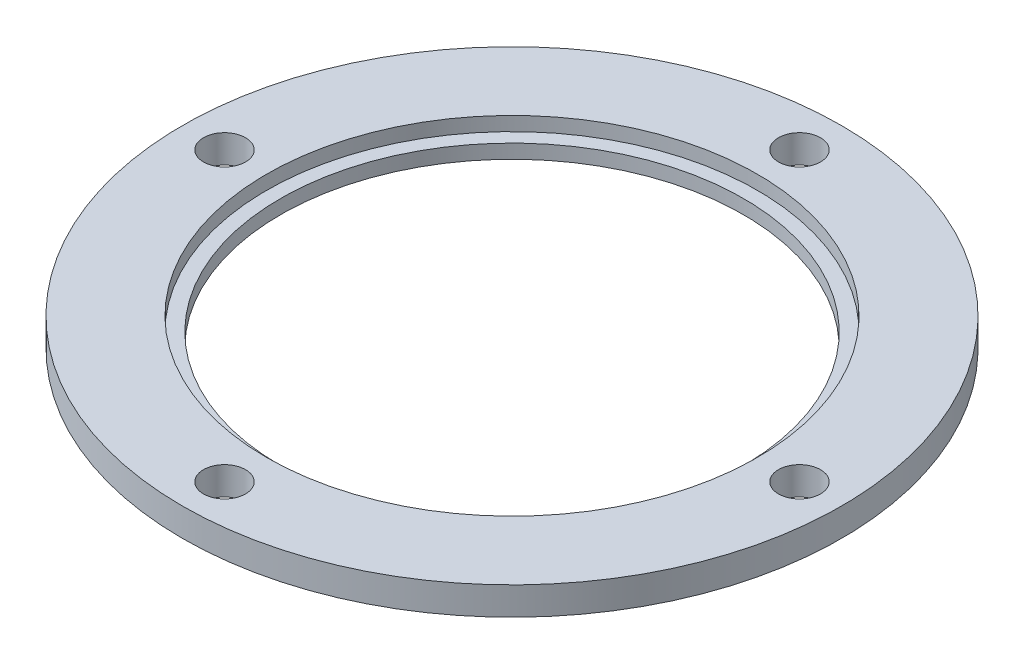
ISO-10303-21;
HEADER;
FILE_DESCRIPTION(('STEP AP214'),'2;1');
FILE_NAME('part.step','',(''),(''),'','','');
FILE_SCHEMA(('AUTOMOTIVE_DESIGN { 1 0 10303 214 1 1 1 1 }'));
ENDSEC;
DATA;
#1=APPLICATION_CONTEXT('core data for automotive mechanical design processes');
#2=APPLICATION_PROTOCOL_DEFINITION('international standard','automotive_design',2000,#1);
#3=PRODUCT_CONTEXT('',#1,'mechanical');
#4=PRODUCT('Part','Part','',(#3));
#5=PRODUCT_RELATED_PRODUCT_CATEGORY('part','',(#4));
#6=PRODUCT_DEFINITION_FORMATION('','',#4);
#7=PRODUCT_DEFINITION_CONTEXT('part definition',#1,'design');
#8=PRODUCT_DEFINITION('design','',#6,#7);
#9=PRODUCT_DEFINITION_SHAPE('','',#8);
#10=(LENGTH_UNIT() NAMED_UNIT(*) SI_UNIT(.MILLI.,.METRE.));
#11=(NAMED_UNIT(*) PLANE_ANGLE_UNIT() SI_UNIT($,.RADIAN.));
#12=(NAMED_UNIT(*) SI_UNIT($,.STERADIAN.) SOLID_ANGLE_UNIT());
#13=UNCERTAINTY_MEASURE_WITH_UNIT(LENGTH_MEASURE(1.E-05),#10,'distance_accuracy_value','');
#14=(GEOMETRIC_REPRESENTATION_CONTEXT(3) GLOBAL_UNCERTAINTY_ASSIGNED_CONTEXT((#13)) GLOBAL_UNIT_ASSIGNED_CONTEXT((#10,
#11,#12)) REPRESENTATION_CONTEXT('',''));
#15=CARTESIAN_POINT('',(0.,0.,0.));
#16=DIRECTION('',(0.,0.,1.));
#17=DIRECTION('',(1.,0.,0.));
#18=AXIS2_PLACEMENT_3D('',#15,#16,#17);
#19=CARTESIAN_POINT('',(0.,1.,0.));
#20=DIRECTION('',(0.,1.,0.));
#21=DIRECTION('',(0.,0.,1.));
#22=AXIS2_PLACEMENT_3D('',#19,#20,#21);
#23=PLANE('',#22);
#24=CARTESIAN_POINT('',(0.,1.,0.));
#25=DIRECTION('',(0.,1.,0.));
#26=DIRECTION('',(0.,0.,1.));
#27=AXIS2_PLACEMENT_3D('',#24,#25,#26);
#28=CIRCLE('',#27,16.5);
#29=CARTESIAN_POINT('',(0.,1.,16.5));
#30=VERTEX_POINT('',#29);
#31=EDGE_CURVE('E10',#30,#30,#28,.T.);
#32=ORIENTED_EDGE('',*,*,#31,.F.);
#33=EDGE_LOOP('',(#32));
#34=FACE_BOUND('',#33,.T.);
#35=CARTESIAN_POINT('',(0.,1.,0.));
#36=DIRECTION('',(0.,1.,0.));
#37=DIRECTION('',(0.,0.,1.));
#38=AXIS2_PLACEMENT_3D('',#35,#36,#37);
#39=CIRCLE('',#38,17.5);
#40=CARTESIAN_POINT('',(0.,1.,17.5));
#41=VERTEX_POINT('',#40);
#42=EDGE_CURVE('E61',#41,#41,#39,.T.);
#43=ORIENTED_EDGE('',*,*,#42,.T.);
#44=EDGE_LOOP('',(#43));
#45=FACE_BOUND('',#44,.T.);
#46=ADVANCED_FACE('F41',(#34,#45),#23,.T.);
#47=CARTESIAN_POINT('',(0.,1.,0.));
#48=DIRECTION('',(0.,-1.,0.));
#49=DIRECTION('',(0.,0.,-1.));
#50=AXIS2_PLACEMENT_3D('',#47,#48,#49);
#51=CYLINDRICAL_SURFACE('',#50,23.5);
#52=CARTESIAN_POINT('',(0.,0.,0.));
#53=DIRECTION('',(0.,1.,0.));
#54=DIRECTION('',(0.,0.,1.));
#55=AXIS2_PLACEMENT_3D('',#52,#53,#54);
#56=CIRCLE('',#55,23.5);
#57=CARTESIAN_POINT('',(0.,0.,23.5));
#58=VERTEX_POINT('',#57);
#59=EDGE_CURVE('E52',#58,#58,#56,.T.);
#60=ORIENTED_EDGE('',*,*,#59,.T.);
#61=EDGE_LOOP('',(#60));
#62=FACE_BOUND('',#61,.T.);
#63=CARTESIAN_POINT('',(0.,2.,0.));
#64=DIRECTION('',(0.,1.,0.));
#65=DIRECTION('',(0.,0.,1.));
#66=AXIS2_PLACEMENT_3D('',#63,#64,#65);
#67=CIRCLE('',#66,23.5);
#68=CARTESIAN_POINT('',(0.,2.,23.5));
#69=VERTEX_POINT('',#68);
#70=EDGE_CURVE('E54',#69,#69,#67,.T.);
#71=ORIENTED_EDGE('',*,*,#70,.F.);
#72=EDGE_LOOP('',(#71));
#73=FACE_BOUND('',#72,.T.);
#74=ADVANCED_FACE('F43',(#62,#73),#51,.T.);
#75=CARTESIAN_POINT('',(0.,1.,0.));
#76=DIRECTION('',(0.,-1.,0.));
#77=DIRECTION('',(0.,0.,-1.));
#78=AXIS2_PLACEMENT_3D('',#75,#76,#77);
#79=CYLINDRICAL_SURFACE('',#78,16.5);
#80=ORIENTED_EDGE('',*,*,#31,.T.);
#81=EDGE_LOOP('',(#80));
#82=FACE_BOUND('',#81,.T.);
#83=CARTESIAN_POINT('',(0.,0.,0.));
#84=DIRECTION('',(0.,1.,0.));
#85=DIRECTION('',(0.,0.,1.));
#86=AXIS2_PLACEMENT_3D('',#83,#84,#85);
#87=CIRCLE('',#86,16.5);
#88=CARTESIAN_POINT('',(0.,0.,16.5));
#89=VERTEX_POINT('',#88);
#90=EDGE_CURVE('E44',#89,#89,#87,.T.);
#91=ORIENTED_EDGE('',*,*,#90,.F.);
#92=EDGE_LOOP('',(#91));
#93=FACE_BOUND('',#92,.T.);
#94=ADVANCED_FACE('F122',(#82,#93),#79,.F.);
#95=CARTESIAN_POINT('',(0.,0.,0.));
#96=DIRECTION('',(0.,1.,0.));
#97=DIRECTION('',(0.,0.,1.));
#98=AXIS2_PLACEMENT_3D('',#95,#96,#97);
#99=PLANE('',#98);
#100=CARTESIAN_POINT('',(0.,0.,-20.5));
#101=DIRECTION('',(0.,1.,0.));
#102=DIRECTION('',(0.,0.,1.));
#103=AXIS2_PLACEMENT_3D('',#100,#101,#102);
#104=CIRCLE('',#103,1.5);
#105=CARTESIAN_POINT('',(0.,0.,-19.));
#106=VERTEX_POINT('',#105);
#107=EDGE_CURVE('E66',#106,#106,#104,.T.);
#108=ORIENTED_EDGE('',*,*,#107,.T.);
#109=EDGE_LOOP('',(#108));
#110=FACE_BOUND('',#109,.T.);
#111=CARTESIAN_POINT('',(20.5,0.,0.));
#112=DIRECTION('',(0.,1.,0.));
#113=DIRECTION('',(0.,0.,1.));
#114=AXIS2_PLACEMENT_3D('',#111,#112,#113);
#115=CIRCLE('',#114,1.5);
#116=CARTESIAN_POINT('',(20.5,0.,1.50000000000007));
#117=VERTEX_POINT('',#116);
#118=EDGE_CURVE('E74',#117,#117,#115,.T.);
#119=ORIENTED_EDGE('',*,*,#118,.T.);
#120=EDGE_LOOP('',(#119));
#121=FACE_BOUND('',#120,.T.);
#122=CARTESIAN_POINT('',(-1.43150734892569E-13,0.,20.5));
#123=DIRECTION('',(0.,1.,0.));
#124=DIRECTION('',(0.,0.,1.));
#125=AXIS2_PLACEMENT_3D('',#122,#123,#124);
#126=CIRCLE('',#125,1.5);
#127=CARTESIAN_POINT('',(-1.43150734892569E-13,0.,22.));
#128=VERTEX_POINT('',#127);
#129=EDGE_CURVE('E79',#128,#128,#126,.T.);
#130=ORIENTED_EDGE('',*,*,#129,.T.);
#131=EDGE_LOOP('',(#130));
#132=FACE_BOUND('',#131,.T.);
#133=CARTESIAN_POINT('',(-20.5,0.,-2.14726102338853E-13));
#134=DIRECTION('',(0.,1.,0.));
#135=DIRECTION('',(0.,0.,1.));
#136=AXIS2_PLACEMENT_3D('',#133,#134,#135);
#137=CIRCLE('',#136,1.5);
#138=CARTESIAN_POINT('',(-20.5,0.,1.49999999999979));
#139=VERTEX_POINT('',#138);
#140=EDGE_CURVE('E76',#139,#139,#137,.T.);
#141=ORIENTED_EDGE('',*,*,#140,.T.);
#142=EDGE_LOOP('',(#141));
#143=FACE_BOUND('',#142,.T.);
#144=ORIENTED_EDGE('',*,*,#59,.F.);
#145=EDGE_LOOP('',(#144));
#146=FACE_BOUND('',#145,.T.);
#147=ORIENTED_EDGE('',*,*,#90,.T.);
#148=EDGE_LOOP('',(#147));
#149=FACE_BOUND('',#148,.T.);
#150=ADVANCED_FACE('F103',(#110,#121,#132,#143,#146,#149),#99,.F.);
#151=CARTESIAN_POINT('',(0.,2.,0.));
#152=DIRECTION('',(0.,1.,0.));
#153=DIRECTION('',(0.,0.,1.));
#154=AXIS2_PLACEMENT_3D('',#151,#152,#153);
#155=PLANE('',#154);
#156=CARTESIAN_POINT('',(0.,2.,-20.5));
#157=DIRECTION('',(0.,1.,0.));
#158=DIRECTION('',(0.,0.,1.));
#159=AXIS2_PLACEMENT_3D('',#156,#157,#158);
#160=CIRCLE('',#159,1.5);
#161=CARTESIAN_POINT('',(0.,2.,-19.));
#162=VERTEX_POINT('',#161);
#163=EDGE_CURVE('E83',#162,#162,#160,.T.);
#164=ORIENTED_EDGE('',*,*,#163,.F.);
#165=EDGE_LOOP('',(#164));
#166=FACE_BOUND('',#165,.T.);
#167=CARTESIAN_POINT('',(20.5,2.,0.));
#168=DIRECTION('',(0.,1.,0.));
#169=DIRECTION('',(0.,0.,1.));
#170=AXIS2_PLACEMENT_3D('',#167,#168,#169);
#171=CIRCLE('',#170,1.5);
#172=CARTESIAN_POINT('',(20.5,2.,1.50000000000007));
#173=VERTEX_POINT('',#172);
#174=EDGE_CURVE('E89',#173,#173,#171,.T.);
#175=ORIENTED_EDGE('',*,*,#174,.F.);
#176=EDGE_LOOP('',(#175));
#177=FACE_BOUND('',#176,.T.);
#178=CARTESIAN_POINT('',(-1.43150734892569E-13,2.,20.5));
#179=DIRECTION('',(0.,1.,0.));
#180=DIRECTION('',(0.,0.,1.));
#181=AXIS2_PLACEMENT_3D('',#178,#179,#180);
#182=CIRCLE('',#181,1.5);
#183=CARTESIAN_POINT('',(-1.43150734892569E-13,2.,22.));
#184=VERTEX_POINT('',#183);
#185=EDGE_CURVE('E87',#184,#184,#182,.T.);
#186=ORIENTED_EDGE('',*,*,#185,.F.);
#187=EDGE_LOOP('',(#186));
#188=FACE_BOUND('',#187,.T.);
#189=CARTESIAN_POINT('',(-20.5,2.,-2.14726102338853E-13));
#190=DIRECTION('',(0.,1.,0.));
#191=DIRECTION('',(0.,0.,1.));
#192=AXIS2_PLACEMENT_3D('',#189,#190,#191);
#193=CIRCLE('',#192,1.5);
#194=CARTESIAN_POINT('',(-20.5,2.,1.49999999999979));
#195=VERTEX_POINT('',#194);
#196=EDGE_CURVE('E84',#195,#195,#193,.T.);
#197=ORIENTED_EDGE('',*,*,#196,.F.);
#198=EDGE_LOOP('',(#197));
#199=FACE_BOUND('',#198,.T.);
#200=ORIENTED_EDGE('',*,*,#70,.T.);
#201=EDGE_LOOP('',(#200));
#202=FACE_BOUND('',#201,.T.);
#203=CARTESIAN_POINT('',(0.,2.,0.));
#204=DIRECTION('',(0.,1.,0.));
#205=DIRECTION('',(0.,0.,1.));
#206=AXIS2_PLACEMENT_3D('',#203,#204,#205);
#207=CIRCLE('',#206,17.5);
#208=CARTESIAN_POINT('',(0.,2.,17.5));
#209=VERTEX_POINT('',#208);
#210=EDGE_CURVE('E63',#209,#209,#207,.T.);
#211=ORIENTED_EDGE('',*,*,#210,.F.);
#212=EDGE_LOOP('',(#211));
#213=FACE_BOUND('',#212,.T.);
#214=ADVANCED_FACE('F97',(#166,#177,#188,#199,#202,#213),#155,.T.);
#215=CARTESIAN_POINT('',(0.,2.,0.));
#216=DIRECTION('',(0.,-1.,0.));
#217=DIRECTION('',(0.,0.,-1.));
#218=AXIS2_PLACEMENT_3D('',#215,#216,#217);
#219=CYLINDRICAL_SURFACE('',#218,17.5);
#220=ORIENTED_EDGE('',*,*,#210,.T.);
#221=EDGE_LOOP('',(#220));
#222=FACE_BOUND('',#221,.T.);
#223=ORIENTED_EDGE('',*,*,#42,.F.);
#224=EDGE_LOOP('',(#223));
#225=FACE_BOUND('',#224,.T.);
#226=ADVANCED_FACE('F105',(#222,#225),#219,.F.);
#227=CARTESIAN_POINT('',(-20.5,-9.,-2.14726102338853E-13));
#228=DIRECTION('',(0.,1.,0.));
#229=DIRECTION('',(0.,0.,1.));
#230=AXIS2_PLACEMENT_3D('',#227,#228,#229);
#231=CYLINDRICAL_SURFACE('',#230,1.5);
#232=ORIENTED_EDGE('',*,*,#196,.T.);
#233=EDGE_LOOP('',(#232));
#234=FACE_BOUND('',#233,.T.);
#235=ORIENTED_EDGE('',*,*,#140,.F.);
#236=EDGE_LOOP('',(#235));
#237=FACE_BOUND('',#236,.T.);
#238=ADVANCED_FACE('F115',(#234,#237),#231,.F.);
#239=CARTESIAN_POINT('',(-1.43150734892569E-13,-9.,20.5));
#240=DIRECTION('',(0.,1.,0.));
#241=DIRECTION('',(0.,0.,1.));
#242=AXIS2_PLACEMENT_3D('',#239,#240,#241);
#243=CYLINDRICAL_SURFACE('',#242,1.5);
#244=ORIENTED_EDGE('',*,*,#185,.T.);
#245=EDGE_LOOP('',(#244));
#246=FACE_BOUND('',#245,.T.);
#247=ORIENTED_EDGE('',*,*,#129,.F.);
#248=EDGE_LOOP('',(#247));
#249=FACE_BOUND('',#248,.T.);
#250=ADVANCED_FACE('F113',(#246,#249),#243,.F.);
#251=CARTESIAN_POINT('',(20.5,-9.,0.));
#252=DIRECTION('',(0.,1.,0.));
#253=DIRECTION('',(0.,0.,1.));
#254=AXIS2_PLACEMENT_3D('',#251,#252,#253);
#255=CYLINDRICAL_SURFACE('',#254,1.5);
#256=ORIENTED_EDGE('',*,*,#174,.T.);
#257=EDGE_LOOP('',(#256));
#258=FACE_BOUND('',#257,.T.);
#259=ORIENTED_EDGE('',*,*,#118,.F.);
#260=EDGE_LOOP('',(#259));
#261=FACE_BOUND('',#260,.T.);
#262=ADVANCED_FACE('F142',(#258,#261),#255,.F.);
#263=CARTESIAN_POINT('',(0.,-9.,-20.5));
#264=DIRECTION('',(0.,1.,0.));
#265=DIRECTION('',(0.,0.,1.));
#266=AXIS2_PLACEMENT_3D('',#263,#264,#265);
#267=CYLINDRICAL_SURFACE('',#266,1.5);
#268=ORIENTED_EDGE('',*,*,#163,.T.);
#269=EDGE_LOOP('',(#268));
#270=FACE_BOUND('',#269,.T.);
#271=ORIENTED_EDGE('',*,*,#107,.F.);
#272=EDGE_LOOP('',(#271));
#273=FACE_BOUND('',#272,.T.);
#274=ADVANCED_FACE('F96',(#270,#273),#267,.F.);
#275=CLOSED_SHELL('',(#46,#74,#94,#150,#214,#226,#238,#250,#262,#274));
#276=MANIFOLD_SOLID_BREP('B2',#275);
#277=ADVANCED_BREP_SHAPE_REPRESENTATION('',(#18,#276),#14);
#278=SHAPE_DEFINITION_REPRESENTATION(#9,#277);
ENDSEC;
END-ISO-10303-21;
